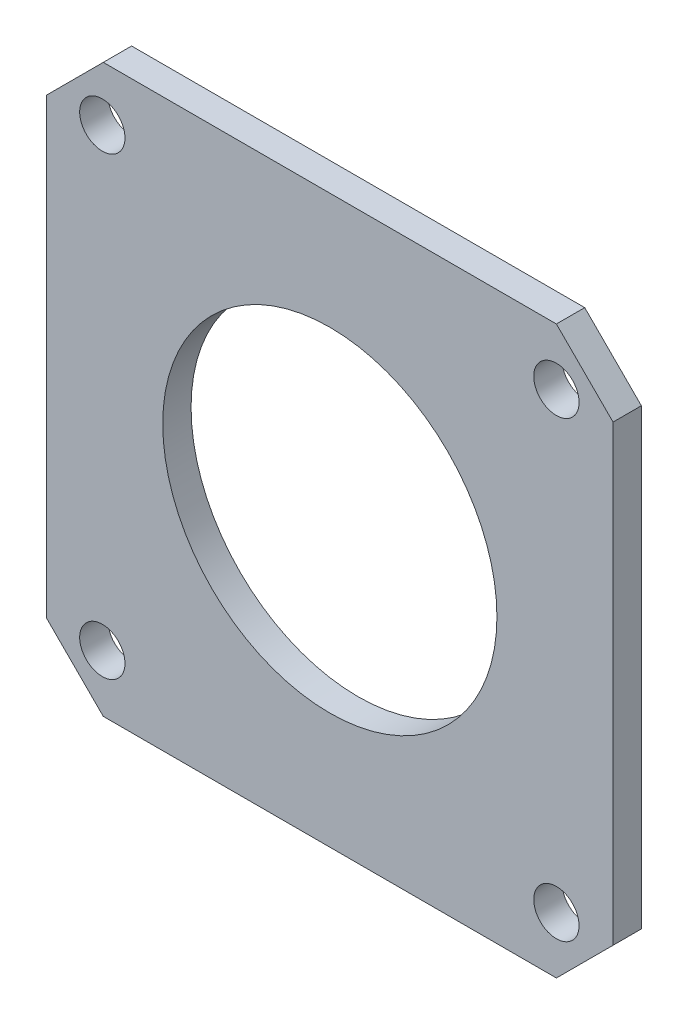
ISO-10303-21;
HEADER;
FILE_DESCRIPTION(('STEP AP214'),'2;1');
FILE_NAME('part.step','',(''),(''),'','','');
FILE_SCHEMA(('AUTOMOTIVE_DESIGN { 1 0 10303 214 1 1 1 1 }'));
ENDSEC;
DATA;
#1=APPLICATION_CONTEXT('core data for automotive mechanical design processes');
#2=APPLICATION_PROTOCOL_DEFINITION('international standard','automotive_design',2000,#1);
#3=PRODUCT_CONTEXT('',#1,'mechanical');
#4=PRODUCT('Part','Part','',(#3));
#5=PRODUCT_RELATED_PRODUCT_CATEGORY('part','',(#4));
#6=PRODUCT_DEFINITION_FORMATION('','',#4);
#7=PRODUCT_DEFINITION_CONTEXT('part definition',#1,'design');
#8=PRODUCT_DEFINITION('design','',#6,#7);
#9=PRODUCT_DEFINITION_SHAPE('','',#8);
#10=(LENGTH_UNIT() NAMED_UNIT(*) SI_UNIT(.MILLI.,.METRE.));
#11=(NAMED_UNIT(*) PLANE_ANGLE_UNIT() SI_UNIT($,.RADIAN.));
#12=(NAMED_UNIT(*) SI_UNIT($,.STERADIAN.) SOLID_ANGLE_UNIT());
#13=UNCERTAINTY_MEASURE_WITH_UNIT(LENGTH_MEASURE(1.E-05),#10,'distance_accuracy_value','');
#14=(GEOMETRIC_REPRESENTATION_CONTEXT(3) GLOBAL_UNCERTAINTY_ASSIGNED_CONTEXT((#13)) GLOBAL_UNIT_ASSIGNED_CONTEXT((#10,
#11,#12)) REPRESENTATION_CONTEXT('',''));
#15=CARTESIAN_POINT('',(0.,0.,0.));
#16=DIRECTION('',(0.,0.,1.));
#17=DIRECTION('',(1.,0.,0.));
#18=AXIS2_PLACEMENT_3D('',#15,#16,#17);
#19=CARTESIAN_POINT('',(0.,90.,-5.));
#20=DIRECTION('',(-0.707106781186547,0.707106781186548,0.));
#21=DIRECTION('',(-0.707106781186548,-0.707106781186547,0.));
#22=AXIS2_PLACEMENT_3D('',#19,#20,#21);
#23=PLANE('',#22);
#24=DIRECTION('',(-0.707106781186548,-0.707106781186547,0.));
#25=VECTOR('',#24,1.);
#26=CARTESIAN_POINT('',(0.,90.,0.));
#27=LINE('',#26,#25);
#28=CARTESIAN_POINT('',(10.,100.,0.));
#29=VERTEX_POINT('',#28);
#30=CARTESIAN_POINT('',(0.,90.,0.));
#31=VERTEX_POINT('',#30);
#32=EDGE_CURVE('E161',#29,#31,#27,.T.);
#33=ORIENTED_EDGE('',*,*,#32,.F.);
#34=DIRECTION('',(0.,0.,1.));
#35=VECTOR('',#34,1.);
#36=CARTESIAN_POINT('',(10.,100.,-5.));
#37=LINE('',#36,#35);
#38=CARTESIAN_POINT('',(10.,100.,-5.));
#39=VERTEX_POINT('',#38);
#40=EDGE_CURVE('E12',#39,#29,#37,.T.);
#41=ORIENTED_EDGE('',*,*,#40,.F.);
#42=DIRECTION('',(-0.707106781186548,-0.707106781186547,0.));
#43=VECTOR('',#42,1.);
#44=CARTESIAN_POINT('',(0.,90.,-5.));
#45=LINE('',#44,#43);
#46=CARTESIAN_POINT('',(0.,90.,-5.));
#47=VERTEX_POINT('',#46);
#48=EDGE_CURVE('E190',#39,#47,#45,.T.);
#49=ORIENTED_EDGE('',*,*,#48,.T.);
#50=DIRECTION('',(0.,0.,1.));
#51=VECTOR('',#50,1.);
#52=CARTESIAN_POINT('',(0.,90.,-5.));
#53=LINE('',#52,#51);
#54=EDGE_CURVE('E114',#47,#31,#53,.T.);
#55=ORIENTED_EDGE('',*,*,#54,.T.);
#56=EDGE_LOOP('',(#33,#41,#49,#55));
#57=FACE_BOUND('',#56,.T.);
#58=ADVANCED_FACE('F57',(#57),#23,.T.);
#59=CARTESIAN_POINT('',(10.,100.,-5.));
#60=DIRECTION('',(0.,1.,0.));
#61=DIRECTION('',(0.,0.,1.));
#62=AXIS2_PLACEMENT_3D('',#59,#60,#61);
#63=PLANE('',#62);
#64=DIRECTION('',(-1.,0.,0.));
#65=VECTOR('',#64,1.);
#66=CARTESIAN_POINT('',(10.,100.,0.));
#67=LINE('',#66,#65);
#68=CARTESIAN_POINT('',(90.,100.,0.));
#69=VERTEX_POINT('',#68);
#70=EDGE_CURVE('E187',#69,#29,#67,.T.);
#71=ORIENTED_EDGE('',*,*,#70,.F.);
#72=DIRECTION('',(0.,0.,1.));
#73=VECTOR('',#72,1.);
#74=CARTESIAN_POINT('',(90.,100.,-5.));
#75=LINE('',#74,#73);
#76=CARTESIAN_POINT('',(90.,100.,-5.));
#77=VERTEX_POINT('',#76);
#78=EDGE_CURVE('E67',#77,#69,#75,.T.);
#79=ORIENTED_EDGE('',*,*,#78,.F.);
#80=DIRECTION('',(-1.,0.,0.));
#81=VECTOR('',#80,1.);
#82=CARTESIAN_POINT('',(10.,100.,-5.));
#83=LINE('',#82,#81);
#84=EDGE_CURVE('E147',#77,#39,#83,.T.);
#85=ORIENTED_EDGE('',*,*,#84,.T.);
#86=ORIENTED_EDGE('',*,*,#40,.T.);
#87=EDGE_LOOP('',(#71,#79,#85,#86));
#88=FACE_BOUND('',#87,.T.);
#89=ADVANCED_FACE('F209',(#88),#63,.T.);
#90=CARTESIAN_POINT('',(90.,100.,-5.));
#91=DIRECTION('',(0.707106781186548,0.707106781186548,0.));
#92=DIRECTION('',(-0.707106781186548,0.707106781186548,0.));
#93=AXIS2_PLACEMENT_3D('',#90,#91,#92);
#94=PLANE('',#93);
#95=DIRECTION('',(-0.707106781186547,0.707106781186547,0.));
#96=VECTOR('',#95,1.);
#97=CARTESIAN_POINT('',(90.,100.,0.));
#98=LINE('',#97,#96);
#99=CARTESIAN_POINT('',(100.,90.,0.));
#100=VERTEX_POINT('',#99);
#101=EDGE_CURVE('E133',#100,#69,#98,.T.);
#102=ORIENTED_EDGE('',*,*,#101,.F.);
#103=DIRECTION('',(0.,0.,1.));
#104=VECTOR('',#103,1.);
#105=CARTESIAN_POINT('',(100.,90.,-5.));
#106=LINE('',#105,#104);
#107=CARTESIAN_POINT('',(100.,90.,-5.));
#108=VERTEX_POINT('',#107);
#109=EDGE_CURVE('E128',#108,#100,#106,.T.);
#110=ORIENTED_EDGE('',*,*,#109,.F.);
#111=DIRECTION('',(-0.707106781186547,0.707106781186547,0.));
#112=VECTOR('',#111,1.);
#113=CARTESIAN_POINT('',(90.,100.,-5.));
#114=LINE('',#113,#112);
#115=EDGE_CURVE('E131',#108,#77,#114,.T.);
#116=ORIENTED_EDGE('',*,*,#115,.T.);
#117=ORIENTED_EDGE('',*,*,#78,.T.);
#118=EDGE_LOOP('',(#102,#110,#116,#117));
#119=FACE_BOUND('',#118,.T.);
#120=ADVANCED_FACE('F130',(#119),#94,.T.);
#121=CARTESIAN_POINT('',(100.,10.,-5.));
#122=DIRECTION('',(1.,0.,0.));
#123=DIRECTION('',(0.,1.,0.));
#124=AXIS2_PLACEMENT_3D('',#121,#122,#123);
#125=PLANE('',#124);
#126=DIRECTION('',(0.,1.,0.));
#127=VECTOR('',#126,1.);
#128=CARTESIAN_POINT('',(100.,10.,0.));
#129=LINE('',#128,#127);
#130=CARTESIAN_POINT('',(100.,10.,0.));
#131=VERTEX_POINT('',#130);
#132=EDGE_CURVE('E182',#131,#100,#129,.T.);
#133=ORIENTED_EDGE('',*,*,#132,.F.);
#134=DIRECTION('',(0.,0.,1.));
#135=VECTOR('',#134,1.);
#136=CARTESIAN_POINT('',(100.,10.,-5.));
#137=LINE('',#136,#135);
#138=CARTESIAN_POINT('',(100.,10.,-5.));
#139=VERTEX_POINT('',#138);
#140=EDGE_CURVE('E139',#139,#131,#137,.T.);
#141=ORIENTED_EDGE('',*,*,#140,.F.);
#142=DIRECTION('',(0.,1.,0.));
#143=VECTOR('',#142,1.);
#144=CARTESIAN_POINT('',(100.,10.,-5.));
#145=LINE('',#144,#143);
#146=EDGE_CURVE('E145',#139,#108,#145,.T.);
#147=ORIENTED_EDGE('',*,*,#146,.T.);
#148=ORIENTED_EDGE('',*,*,#109,.T.);
#149=EDGE_LOOP('',(#133,#141,#147,#148));
#150=FACE_BOUND('',#149,.T.);
#151=ADVANCED_FACE('F150',(#150),#125,.T.);
#152=CARTESIAN_POINT('',(90.,0.,-5.));
#153=DIRECTION('',(0.707106781186548,-0.707106781186547,0.));
#154=DIRECTION('',(0.707106781186547,0.707106781186548,0.));
#155=AXIS2_PLACEMENT_3D('',#152,#153,#154);
#156=PLANE('',#155);
#157=DIRECTION('',(0.707106781186547,0.707106781186548,0.));
#158=VECTOR('',#157,1.);
#159=CARTESIAN_POINT('',(90.,0.,0.));
#160=LINE('',#159,#158);
#161=CARTESIAN_POINT('',(90.,0.,0.));
#162=VERTEX_POINT('',#161);
#163=EDGE_CURVE('E178',#162,#131,#160,.T.);
#164=ORIENTED_EDGE('',*,*,#163,.F.);
#165=DIRECTION('',(0.,0.,1.));
#166=VECTOR('',#165,1.);
#167=CARTESIAN_POINT('',(90.,0.,-5.));
#168=LINE('',#167,#166);
#169=CARTESIAN_POINT('',(90.,0.,-5.));
#170=VERTEX_POINT('',#169);
#171=EDGE_CURVE('E196',#170,#162,#168,.T.);
#172=ORIENTED_EDGE('',*,*,#171,.F.);
#173=DIRECTION('',(0.707106781186547,0.707106781186548,0.));
#174=VECTOR('',#173,1.);
#175=CARTESIAN_POINT('',(90.,0.,-5.));
#176=LINE('',#175,#174);
#177=EDGE_CURVE('E152',#170,#139,#176,.T.);
#178=ORIENTED_EDGE('',*,*,#177,.T.);
#179=ORIENTED_EDGE('',*,*,#140,.T.);
#180=EDGE_LOOP('',(#164,#172,#178,#179));
#181=FACE_BOUND('',#180,.T.);
#182=ADVANCED_FACE('F222',(#181),#156,.T.);
#183=CARTESIAN_POINT('',(10.,0.,-5.));
#184=DIRECTION('',(0.,-1.,0.));
#185=DIRECTION('',(1.,0.,0.));
#186=AXIS2_PLACEMENT_3D('',#183,#184,#185);
#187=PLANE('',#186);
#188=DIRECTION('',(1.,0.,0.));
#189=VECTOR('',#188,1.);
#190=CARTESIAN_POINT('',(10.,0.,0.));
#191=LINE('',#190,#189);
#192=CARTESIAN_POINT('',(10.,0.,0.));
#193=VERTEX_POINT('',#192);
#194=EDGE_CURVE('E174',#193,#162,#191,.T.);
#195=ORIENTED_EDGE('',*,*,#194,.F.);
#196=DIRECTION('',(0.,0.,1.));
#197=VECTOR('',#196,1.);
#198=CARTESIAN_POINT('',(10.,0.,-5.));
#199=LINE('',#198,#197);
#200=CARTESIAN_POINT('',(10.,0.,-5.));
#201=VERTEX_POINT('',#200);
#202=EDGE_CURVE('E199',#201,#193,#199,.T.);
#203=ORIENTED_EDGE('',*,*,#202,.F.);
#204=DIRECTION('',(1.,0.,0.));
#205=VECTOR('',#204,1.);
#206=CARTESIAN_POINT('',(10.,0.,-5.));
#207=LINE('',#206,#205);
#208=EDGE_CURVE('E155',#201,#170,#207,.T.);
#209=ORIENTED_EDGE('',*,*,#208,.T.);
#210=ORIENTED_EDGE('',*,*,#171,.T.);
#211=EDGE_LOOP('',(#195,#203,#209,#210));
#212=FACE_BOUND('',#211,.T.);
#213=ADVANCED_FACE('F225',(#212),#187,.T.);
#214=CARTESIAN_POINT('',(0.,10.,-5.));
#215=DIRECTION('',(-0.707106781186548,-0.707106781186548,0.));
#216=DIRECTION('',(0.707106781186548,-0.707106781186548,0.));
#217=AXIS2_PLACEMENT_3D('',#214,#215,#216);
#218=PLANE('',#217);
#219=DIRECTION('',(0.707106781186548,-0.707106781186548,0.));
#220=VECTOR('',#219,1.);
#221=CARTESIAN_POINT('',(0.,10.,0.));
#222=LINE('',#221,#220);
#223=CARTESIAN_POINT('',(0.,10.,0.));
#224=VERTEX_POINT('',#223);
#225=EDGE_CURVE('E170',#224,#193,#222,.T.);
#226=ORIENTED_EDGE('',*,*,#225,.F.);
#227=DIRECTION('',(0.,0.,1.));
#228=VECTOR('',#227,1.);
#229=CARTESIAN_POINT('',(0.,10.,-5.));
#230=LINE('',#229,#228);
#231=CARTESIAN_POINT('',(0.,10.,-5.));
#232=VERTEX_POINT('',#231);
#233=EDGE_CURVE('E202',#232,#224,#230,.T.);
#234=ORIENTED_EDGE('',*,*,#233,.F.);
#235=DIRECTION('',(0.707106781186548,-0.707106781186548,0.));
#236=VECTOR('',#235,1.);
#237=CARTESIAN_POINT('',(0.,10.,-5.));
#238=LINE('',#237,#236);
#239=EDGE_CURVE('E311',#232,#201,#238,.T.);
#240=ORIENTED_EDGE('',*,*,#239,.T.);
#241=ORIENTED_EDGE('',*,*,#202,.T.);
#242=EDGE_LOOP('',(#226,#234,#240,#241));
#243=FACE_BOUND('',#242,.T.);
#244=ADVANCED_FACE('F229',(#243),#218,.T.);
#245=CARTESIAN_POINT('',(0.,10.,-5.));
#246=DIRECTION('',(-1.,0.,0.));
#247=DIRECTION('',(0.,0.,1.));
#248=AXIS2_PLACEMENT_3D('',#245,#246,#247);
#249=PLANE('',#248);
#250=DIRECTION('',(0.,-1.,0.));
#251=VECTOR('',#250,1.);
#252=CARTESIAN_POINT('',(0.,10.,0.));
#253=LINE('',#252,#251);
#254=EDGE_CURVE('E165',#31,#224,#253,.T.);
#255=ORIENTED_EDGE('',*,*,#254,.F.);
#256=ORIENTED_EDGE('',*,*,#54,.F.);
#257=DIRECTION('',(0.,-1.,0.));
#258=VECTOR('',#257,1.);
#259=CARTESIAN_POINT('',(0.,10.,-5.));
#260=LINE('',#259,#258);
#261=EDGE_CURVE('E308',#47,#232,#260,.T.);
#262=ORIENTED_EDGE('',*,*,#261,.T.);
#263=ORIENTED_EDGE('',*,*,#233,.T.);
#264=EDGE_LOOP('',(#255,#256,#262,#263));
#265=FACE_BOUND('',#264,.T.);
#266=ADVANCED_FACE('F205',(#265),#249,.T.);
#267=CARTESIAN_POINT('',(0.,0.,-5.));
#268=DIRECTION('',(0.,0.,-1.));
#269=DIRECTION('',(-1.,0.,0.));
#270=AXIS2_PLACEMENT_3D('',#267,#268,#269);
#271=PLANE('',#270);
#272=CARTESIAN_POINT('',(50.,50.,-5.));
#273=DIRECTION('',(0.,0.,-1.));
#274=DIRECTION('',(-1.,0.,0.));
#275=AXIS2_PLACEMENT_3D('',#272,#273,#274);
#276=CIRCLE('',#275,29.5);
#277=CARTESIAN_POINT('',(20.5,50.,-5.));
#278=VERTEX_POINT('',#277);
#279=EDGE_CURVE('E268',#278,#278,#276,.F.);
#280=ORIENTED_EDGE('',*,*,#279,.T.);
#281=EDGE_LOOP('',(#280));
#282=FACE_BOUND('',#281,.T.);
#283=CARTESIAN_POINT('',(90.,9.99999999999999,-5.));
#284=DIRECTION('',(0.,0.,1.));
#285=DIRECTION('',(1.,0.,0.));
#286=AXIS2_PLACEMENT_3D('',#283,#284,#285);
#287=CIRCLE('',#286,4.00000000000001);
#288=CARTESIAN_POINT('',(94.,9.99999999999999,-5.));
#289=VERTEX_POINT('',#288);
#290=EDGE_CURVE('E277',#289,#289,#287,.T.);
#291=ORIENTED_EDGE('',*,*,#290,.T.);
#292=EDGE_LOOP('',(#291));
#293=FACE_BOUND('',#292,.T.);
#294=CARTESIAN_POINT('',(9.83217400518599,9.99999999999999,-5.));
#295=DIRECTION('',(0.,0.,1.));
#296=DIRECTION('',(1.,0.,0.));
#297=AXIS2_PLACEMENT_3D('',#294,#295,#296);
#298=CIRCLE('',#297,4.);
#299=CARTESIAN_POINT('',(13.832174005186,9.99999999999999,-5.));
#300=VERTEX_POINT('',#299);
#301=EDGE_CURVE('E284',#300,#300,#298,.T.);
#302=ORIENTED_EDGE('',*,*,#301,.T.);
#303=EDGE_LOOP('',(#302));
#304=FACE_BOUND('',#303,.T.);
#305=CARTESIAN_POINT('',(9.83217400518598,90.335651989628,-5.));
#306=DIRECTION('',(0.,0.,1.));
#307=DIRECTION('',(1.,0.,0.));
#308=AXIS2_PLACEMENT_3D('',#305,#306,#307);
#309=CIRCLE('',#308,4.);
#310=CARTESIAN_POINT('',(13.832174005186,90.335651989628,-5.));
#311=VERTEX_POINT('',#310);
#312=EDGE_CURVE('E292',#311,#311,#309,.T.);
#313=ORIENTED_EDGE('',*,*,#312,.T.);
#314=EDGE_LOOP('',(#313));
#315=FACE_BOUND('',#314,.T.);
#316=CARTESIAN_POINT('',(90.,90.,-5.));
#317=DIRECTION('',(0.,0.,1.));
#318=DIRECTION('',(1.,0.,0.));
#319=AXIS2_PLACEMENT_3D('',#316,#317,#318);
#320=CIRCLE('',#319,4.00000000000001);
#321=CARTESIAN_POINT('',(94.,90.,-5.));
#322=VERTEX_POINT('',#321);
#323=EDGE_CURVE('E166',#322,#322,#320,.T.);
#324=ORIENTED_EDGE('',*,*,#323,.T.);
#325=EDGE_LOOP('',(#324));
#326=FACE_BOUND('',#325,.T.);
#327=ORIENTED_EDGE('',*,*,#48,.F.);
#328=ORIENTED_EDGE('',*,*,#84,.F.);
#329=ORIENTED_EDGE('',*,*,#115,.F.);
#330=ORIENTED_EDGE('',*,*,#146,.F.);
#331=ORIENTED_EDGE('',*,*,#177,.F.);
#332=ORIENTED_EDGE('',*,*,#208,.F.);
#333=ORIENTED_EDGE('',*,*,#239,.F.);
#334=ORIENTED_EDGE('',*,*,#261,.F.);
#335=EDGE_LOOP('',(#327,#328,#329,#330,#331,#332,#333,#334));
#336=FACE_BOUND('',#335,.T.);
#337=ADVANCED_FACE('F143',(#282,#293,#304,#315,#326,#336),#271,.T.);
#338=CARTESIAN_POINT('',(0.,0.,0.));
#339=DIRECTION('',(0.,0.,-1.));
#340=DIRECTION('',(-1.,0.,0.));
#341=AXIS2_PLACEMENT_3D('',#338,#339,#340);
#342=PLANE('',#341);
#343=CARTESIAN_POINT('',(50.,50.,0.));
#344=DIRECTION('',(0.,0.,-1.));
#345=DIRECTION('',(-1.,0.,0.));
#346=AXIS2_PLACEMENT_3D('',#343,#344,#345);
#347=CIRCLE('',#346,29.5);
#348=CARTESIAN_POINT('',(20.5,50.,0.));
#349=VERTEX_POINT('',#348);
#350=EDGE_CURVE('E60',#349,#349,#347,.F.);
#351=ORIENTED_EDGE('',*,*,#350,.F.);
#352=EDGE_LOOP('',(#351));
#353=FACE_BOUND('',#352,.T.);
#354=CARTESIAN_POINT('',(90.,9.99999999999999,0.));
#355=DIRECTION('',(0.,0.,1.));
#356=DIRECTION('',(1.,0.,0.));
#357=AXIS2_PLACEMENT_3D('',#354,#355,#356);
#358=CIRCLE('',#357,4.00000000000001);
#359=CARTESIAN_POINT('',(94.,9.99999999999999,0.));
#360=VERTEX_POINT('',#359);
#361=EDGE_CURVE('E273',#360,#360,#358,.T.);
#362=ORIENTED_EDGE('',*,*,#361,.F.);
#363=EDGE_LOOP('',(#362));
#364=FACE_BOUND('',#363,.T.);
#365=CARTESIAN_POINT('',(9.83217400518599,9.99999999999999,0.));
#366=DIRECTION('',(0.,0.,1.));
#367=DIRECTION('',(1.,0.,0.));
#368=AXIS2_PLACEMENT_3D('',#365,#366,#367);
#369=CIRCLE('',#368,4.);
#370=CARTESIAN_POINT('',(13.832174005186,9.99999999999999,0.));
#371=VERTEX_POINT('',#370);
#372=EDGE_CURVE('E282',#371,#371,#369,.T.);
#373=ORIENTED_EDGE('',*,*,#372,.F.);
#374=EDGE_LOOP('',(#373));
#375=FACE_BOUND('',#374,.T.);
#376=CARTESIAN_POINT('',(9.83217400518598,90.335651989628,0.));
#377=DIRECTION('',(0.,0.,1.));
#378=DIRECTION('',(1.,0.,0.));
#379=AXIS2_PLACEMENT_3D('',#376,#377,#378);
#380=CIRCLE('',#379,4.);
#381=CARTESIAN_POINT('',(13.832174005186,90.335651989628,0.));
#382=VERTEX_POINT('',#381);
#383=EDGE_CURVE('E288',#382,#382,#380,.T.);
#384=ORIENTED_EDGE('',*,*,#383,.F.);
#385=EDGE_LOOP('',(#384));
#386=FACE_BOUND('',#385,.T.);
#387=CARTESIAN_POINT('',(90.,90.,0.));
#388=DIRECTION('',(0.,0.,1.));
#389=DIRECTION('',(1.,0.,0.));
#390=AXIS2_PLACEMENT_3D('',#387,#388,#389);
#391=CIRCLE('',#390,4.00000000000001);
#392=CARTESIAN_POINT('',(94.,90.,0.));
#393=VERTEX_POINT('',#392);
#394=EDGE_CURVE('E296',#393,#393,#391,.T.);
#395=ORIENTED_EDGE('',*,*,#394,.F.);
#396=EDGE_LOOP('',(#395));
#397=FACE_BOUND('',#396,.T.);
#398=ORIENTED_EDGE('',*,*,#32,.T.);
#399=ORIENTED_EDGE('',*,*,#254,.T.);
#400=ORIENTED_EDGE('',*,*,#225,.T.);
#401=ORIENTED_EDGE('',*,*,#194,.T.);
#402=ORIENTED_EDGE('',*,*,#163,.T.);
#403=ORIENTED_EDGE('',*,*,#132,.T.);
#404=ORIENTED_EDGE('',*,*,#101,.T.);
#405=ORIENTED_EDGE('',*,*,#70,.T.);
#406=EDGE_LOOP('',(#398,#399,#400,#401,#402,#403,#404,#405));
#407=FACE_BOUND('',#406,.T.);
#408=ADVANCED_FACE('F208',(#353,#364,#375,#386,#397,#407),#342,.F.);
#409=CARTESIAN_POINT('',(90.,90.,-5.));
#410=DIRECTION('',(0.,0.,1.));
#411=DIRECTION('',(1.,0.,0.));
#412=AXIS2_PLACEMENT_3D('',#409,#410,#411);
#413=CYLINDRICAL_SURFACE('',#412,4.00000000000001);
#414=ORIENTED_EDGE('',*,*,#323,.F.);
#415=EDGE_LOOP('',(#414));
#416=FACE_BOUND('',#415,.T.);
#417=ORIENTED_EDGE('',*,*,#394,.T.);
#418=EDGE_LOOP('',(#417));
#419=FACE_BOUND('',#418,.T.);
#420=ADVANCED_FACE('F241',(#416,#419),#413,.F.);
#421=CARTESIAN_POINT('',(9.83217400518598,90.335651989628,-5.));
#422=DIRECTION('',(0.,0.,1.));
#423=DIRECTION('',(1.,0.,0.));
#424=AXIS2_PLACEMENT_3D('',#421,#422,#423);
#425=CYLINDRICAL_SURFACE('',#424,4.);
#426=ORIENTED_EDGE('',*,*,#312,.F.);
#427=EDGE_LOOP('',(#426));
#428=FACE_BOUND('',#427,.T.);
#429=ORIENTED_EDGE('',*,*,#383,.T.);
#430=EDGE_LOOP('',(#429));
#431=FACE_BOUND('',#430,.T.);
#432=ADVANCED_FACE('F248',(#428,#431),#425,.F.);
#433=CARTESIAN_POINT('',(9.83217400518599,9.99999999999999,-5.));
#434=DIRECTION('',(0.,0.,1.));
#435=DIRECTION('',(1.,0.,0.));
#436=AXIS2_PLACEMENT_3D('',#433,#434,#435);
#437=CYLINDRICAL_SURFACE('',#436,4.);
#438=ORIENTED_EDGE('',*,*,#301,.F.);
#439=EDGE_LOOP('',(#438));
#440=FACE_BOUND('',#439,.T.);
#441=ORIENTED_EDGE('',*,*,#372,.T.);
#442=EDGE_LOOP('',(#441));
#443=FACE_BOUND('',#442,.T.);
#444=ADVANCED_FACE('F252',(#440,#443),#437,.F.);
#445=CARTESIAN_POINT('',(90.,9.99999999999999,-5.));
#446=DIRECTION('',(0.,0.,1.));
#447=DIRECTION('',(1.,0.,0.));
#448=AXIS2_PLACEMENT_3D('',#445,#446,#447);
#449=CYLINDRICAL_SURFACE('',#448,4.00000000000001);
#450=ORIENTED_EDGE('',*,*,#290,.F.);
#451=EDGE_LOOP('',(#450));
#452=FACE_BOUND('',#451,.T.);
#453=ORIENTED_EDGE('',*,*,#361,.T.);
#454=EDGE_LOOP('',(#453));
#455=FACE_BOUND('',#454,.T.);
#456=ADVANCED_FACE('F256',(#452,#455),#449,.F.);
#457=CARTESIAN_POINT('',(50.,50.,4.));
#458=DIRECTION('',(0.,0.,-1.));
#459=DIRECTION('',(-1.,0.,0.));
#460=AXIS2_PLACEMENT_3D('',#457,#458,#459);
#461=CYLINDRICAL_SURFACE('',#460,29.5);
#462=ORIENTED_EDGE('',*,*,#279,.F.);
#463=EDGE_LOOP('',(#462));
#464=FACE_BOUND('',#463,.T.);
#465=ORIENTED_EDGE('',*,*,#350,.T.);
#466=EDGE_LOOP('',(#465));
#467=FACE_BOUND('',#466,.T.);
#468=ADVANCED_FACE('F260',(#464,#467),#461,.F.);
#469=CLOSED_SHELL('',(#58,#89,#120,#151,#182,#213,#244,#266,#337,#408,#420,#432,#444,#456,#468));
#470=MANIFOLD_SOLID_BREP('B2',#469);
#471=ADVANCED_BREP_SHAPE_REPRESENTATION('',(#18,#470),#14);
#472=SHAPE_DEFINITION_REPRESENTATION(#9,#471);
ENDSEC;
END-ISO-10303-21;
